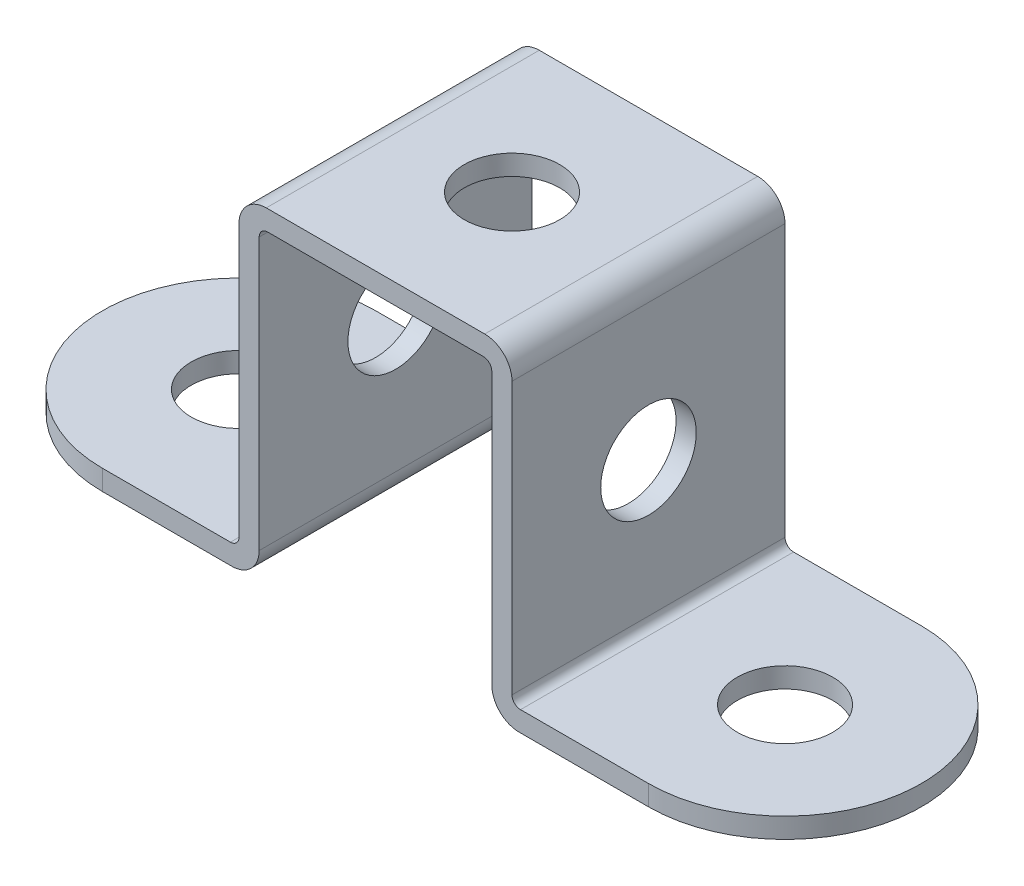
ISO-10303-21;
HEADER;
FILE_DESCRIPTION(('STEP AP214'),'2;1');
FILE_NAME('part.step','',(''),(''),'','','');
FILE_SCHEMA(('AUTOMOTIVE_DESIGN { 1 0 10303 214 1 1 1 1 }'));
ENDSEC;
DATA;
#1=APPLICATION_CONTEXT('core data for automotive mechanical design processes');
#2=APPLICATION_PROTOCOL_DEFINITION('international standard','automotive_design',2000,#1);
#3=PRODUCT_CONTEXT('',#1,'mechanical');
#4=PRODUCT('Part','Part','',(#3));
#5=PRODUCT_RELATED_PRODUCT_CATEGORY('part','',(#4));
#6=PRODUCT_DEFINITION_FORMATION('','',#4);
#7=PRODUCT_DEFINITION_CONTEXT('part definition',#1,'design');
#8=PRODUCT_DEFINITION('design','',#6,#7);
#9=PRODUCT_DEFINITION_SHAPE('','',#8);
#10=(LENGTH_UNIT() NAMED_UNIT(*) SI_UNIT(.MILLI.,.METRE.));
#11=(NAMED_UNIT(*) PLANE_ANGLE_UNIT() SI_UNIT($,.RADIAN.));
#12=(NAMED_UNIT(*) SI_UNIT($,.STERADIAN.) SOLID_ANGLE_UNIT());
#13=UNCERTAINTY_MEASURE_WITH_UNIT(LENGTH_MEASURE(1.E-05),#10,'distance_accuracy_value','');
#14=(GEOMETRIC_REPRESENTATION_CONTEXT(3) GLOBAL_UNCERTAINTY_ASSIGNED_CONTEXT((#13)) GLOBAL_UNIT_ASSIGNED_CONTEXT((#10,
#11,#12)) REPRESENTATION_CONTEXT('',''));
#15=CARTESIAN_POINT('',(0.,0.,0.));
#16=DIRECTION('',(0.,0.,1.));
#17=DIRECTION('',(1.,0.,0.));
#18=AXIS2_PLACEMENT_3D('',#15,#16,#17);
#19=CARTESIAN_POINT('',(25.4,7.62,6.35));
#20=DIRECTION('',(-1.,0.,0.));
#21=DIRECTION('',(0.,0.,1.));
#22=AXIS2_PLACEMENT_3D('',#19,#20,#21);
#23=CYLINDRICAL_SURFACE('',#22,2.2225);
#24=CARTESIAN_POINT('',(13.6398,7.62000000000001,6.35));
#25=DIRECTION('',(-1.,0.,0.));
#26=DIRECTION('',(0.,0.,1.));
#27=AXIS2_PLACEMENT_3D('',#24,#25,#26);
#28=CIRCLE('',#27,2.2225);
#29=CARTESIAN_POINT('',(13.6398,7.62000000000001,8.5725));
#30=VERTEX_POINT('',#29);
#31=EDGE_CURVE('E167',#30,#30,#28,.T.);
#32=ORIENTED_EDGE('',*,*,#31,.F.);
#33=EDGE_LOOP('',(#32));
#34=FACE_BOUND('',#33,.T.);
#35=CARTESIAN_POINT('',(12.7,7.62000000000001,6.35));
#36=DIRECTION('',(1.,0.,0.));
#37=DIRECTION('',(0.,1.,0.));
#38=AXIS2_PLACEMENT_3D('',#35,#36,#37);
#39=CIRCLE('',#38,2.2225);
#40=CARTESIAN_POINT('',(12.7,9.84250000000001,6.35));
#41=VERTEX_POINT('',#40);
#42=EDGE_CURVE('E201',#41,#41,#39,.T.);
#43=ORIENTED_EDGE('',*,*,#42,.F.);
#44=EDGE_LOOP('',(#43));
#45=FACE_BOUND('',#44,.T.);
#46=ADVANCED_FACE('F16',(#34,#45),#23,.F.);
#47=CARTESIAN_POINT('',(25.4,7.62,6.35));
#48=DIRECTION('',(-1.,0.,0.));
#49=DIRECTION('',(0.,0.,1.));
#50=AXIS2_PLACEMENT_3D('',#47,#48,#49);
#51=CYLINDRICAL_SURFACE('',#50,2.2225);
#52=CARTESIAN_POINT('',(24.4602,7.62,6.35));
#53=DIRECTION('',(1.,0.,0.));
#54=DIRECTION('',(0.,1.,0.));
#55=AXIS2_PLACEMENT_3D('',#52,#53,#54);
#56=CIRCLE('',#55,2.2225);
#57=CARTESIAN_POINT('',(24.4602,9.8425,6.35));
#58=VERTEX_POINT('',#57);
#59=EDGE_CURVE('E252',#58,#58,#56,.T.);
#60=ORIENTED_EDGE('',*,*,#59,.F.);
#61=EDGE_LOOP('',(#60));
#62=FACE_BOUND('',#61,.T.);
#63=CARTESIAN_POINT('',(25.4,7.62,6.35));
#64=DIRECTION('',(-1.,0.,0.));
#65=DIRECTION('',(0.,0.,1.));
#66=AXIS2_PLACEMENT_3D('',#63,#64,#65);
#67=CIRCLE('',#66,2.2225);
#68=CARTESIAN_POINT('',(25.4,7.62,8.5725));
#69=VERTEX_POINT('',#68);
#70=EDGE_CURVE('E229',#69,#69,#67,.T.);
#71=ORIENTED_EDGE('',*,*,#70,.F.);
#72=EDGE_LOOP('',(#71));
#73=FACE_BOUND('',#72,.T.);
#74=ADVANCED_FACE('F337',(#62,#73),#51,.F.);
#75=CARTESIAN_POINT('',(6.35,0.,6.35));
#76=DIRECTION('',(0.,1.,0.));
#77=DIRECTION('',(1.,0.,0.));
#78=AXIS2_PLACEMENT_3D('',#75,#76,#77);
#79=CYLINDRICAL_SURFACE('',#78,2.2225);
#80=CARTESIAN_POINT('',(6.35,0.9398,6.35));
#81=DIRECTION('',(0.,-1.,0.));
#82=DIRECTION('',(-1.,0.,0.));
#83=AXIS2_PLACEMENT_3D('',#80,#81,#82);
#84=CIRCLE('',#83,2.2225);
#85=CARTESIAN_POINT('',(4.1275,0.9398,6.35));
#86=VERTEX_POINT('',#85);
#87=EDGE_CURVE('E205',#86,#86,#84,.T.);
#88=ORIENTED_EDGE('',*,*,#87,.F.);
#89=EDGE_LOOP('',(#88));
#90=FACE_BOUND('',#89,.T.);
#91=CARTESIAN_POINT('',(6.35,0.,6.35));
#92=DIRECTION('',(0.,1.,0.));
#93=DIRECTION('',(1.,0.,0.));
#94=AXIS2_PLACEMENT_3D('',#91,#92,#93);
#95=CIRCLE('',#94,2.2225);
#96=CARTESIAN_POINT('',(8.5725,0.,6.35));
#97=VERTEX_POINT('',#96);
#98=EDGE_CURVE('E309',#97,#97,#95,.T.);
#99=ORIENTED_EDGE('',*,*,#98,.F.);
#100=EDGE_LOOP('',(#99));
#101=FACE_BOUND('',#100,.T.);
#102=ADVANCED_FACE('F375',(#90,#101),#79,.F.);
#103=CARTESIAN_POINT('',(6.35,0.,6.35));
#104=DIRECTION('',(0.,1.,0.));
#105=DIRECTION('',(1.,0.,0.));
#106=AXIS2_PLACEMENT_3D('',#103,#104,#105);
#107=CYLINDRICAL_SURFACE('',#106,6.35);
#108=CARTESIAN_POINT('',(6.35,0.9398,6.35));
#109=DIRECTION('',(0.,1.,0.));
#110=DIRECTION('',(1.,0.,0.));
#111=AXIS2_PLACEMENT_3D('',#108,#109,#110);
#112=CIRCLE('',#111,6.35);
#113=CARTESIAN_POINT('',(6.35,0.9398,0.));
#114=VERTEX_POINT('',#113);
#115=CARTESIAN_POINT('',(6.35,0.9398,12.7));
#116=VERTEX_POINT('',#115);
#117=EDGE_CURVE('E34',#114,#116,#112,.T.);
#118=ORIENTED_EDGE('',*,*,#117,.F.);
#119=DIRECTION('',(0.,-1.,0.));
#120=VECTOR('',#119,1.);
#121=CARTESIAN_POINT('',(6.35,0.,0.));
#122=LINE('',#121,#120);
#123=CARTESIAN_POINT('',(6.35,0.,0.));
#124=VERTEX_POINT('',#123);
#125=EDGE_CURVE('E11',#114,#124,#122,.T.);
#126=ORIENTED_EDGE('',*,*,#125,.T.);
#127=CARTESIAN_POINT('',(6.35,0.,6.35));
#128=DIRECTION('',(0.,-1.,0.));
#129=DIRECTION('',(0.,0.,-1.));
#130=AXIS2_PLACEMENT_3D('',#127,#128,#129);
#131=CIRCLE('',#130,6.35);
#132=CARTESIAN_POINT('',(6.35,0.,12.7));
#133=VERTEX_POINT('',#132);
#134=EDGE_CURVE('E182',#133,#124,#131,.T.);
#135=ORIENTED_EDGE('',*,*,#134,.F.);
#136=DIRECTION('',(0.,-1.,0.));
#137=VECTOR('',#136,1.);
#138=CARTESIAN_POINT('',(6.35,0.,12.7));
#139=LINE('',#138,#137);
#140=EDGE_CURVE('E161',#116,#133,#139,.T.);
#141=ORIENTED_EDGE('',*,*,#140,.F.);
#142=EDGE_LOOP('',(#118,#126,#135,#141));
#143=FACE_BOUND('',#142,.T.);
#144=ADVANCED_FACE('F378',(#143),#107,.T.);
#145=CARTESIAN_POINT('',(19.05,0.,6.35));
#146=DIRECTION('',(0.,1.,0.));
#147=DIRECTION('',(1.,0.,0.));
#148=AXIS2_PLACEMENT_3D('',#145,#146,#147);
#149=CYLINDRICAL_SURFACE('',#148,2.2225);
#150=CARTESIAN_POINT('',(19.05,15.24,6.35));
#151=DIRECTION('',(0.,-1.,0.));
#152=DIRECTION('',(0.,0.,-1.));
#153=AXIS2_PLACEMENT_3D('',#150,#151,#152);
#154=CIRCLE('',#153,2.2225);
#155=CARTESIAN_POINT('',(19.05,15.24,4.1275));
#156=VERTEX_POINT('',#155);
#157=EDGE_CURVE('E216',#156,#156,#154,.T.);
#158=ORIENTED_EDGE('',*,*,#157,.F.);
#159=EDGE_LOOP('',(#158));
#160=FACE_BOUND('',#159,.T.);
#161=CARTESIAN_POINT('',(19.05,14.3002,6.35));
#162=DIRECTION('',(0.,1.,0.));
#163=DIRECTION('',(1.,0.,0.));
#164=AXIS2_PLACEMENT_3D('',#161,#162,#163);
#165=CIRCLE('',#164,2.2225);
#166=CARTESIAN_POINT('',(21.2725,14.3002,6.35));
#167=VERTEX_POINT('',#166);
#168=EDGE_CURVE('E267',#167,#167,#165,.T.);
#169=ORIENTED_EDGE('',*,*,#168,.F.);
#170=EDGE_LOOP('',(#169));
#171=FACE_BOUND('',#170,.T.);
#172=ADVANCED_FACE('F429',(#160,#171),#149,.F.);
#173=CARTESIAN_POINT('',(31.75,0.,6.35));
#174=DIRECTION('',(0.,1.,0.));
#175=DIRECTION('',(1.,0.,0.));
#176=AXIS2_PLACEMENT_3D('',#173,#174,#175);
#177=CYLINDRICAL_SURFACE('',#176,6.35);
#178=CARTESIAN_POINT('',(31.75,0.939799999999998,6.35));
#179=DIRECTION('',(0.,1.,0.));
#180=DIRECTION('',(1.,0.,0.));
#181=AXIS2_PLACEMENT_3D('',#178,#179,#180);
#182=CIRCLE('',#181,6.35);
#183=CARTESIAN_POINT('',(31.75,0.939800000000006,12.7));
#184=VERTEX_POINT('',#183);
#185=CARTESIAN_POINT('',(31.75,0.939800000000006,0.));
#186=VERTEX_POINT('',#185);
#187=EDGE_CURVE('E292',#184,#186,#182,.T.);
#188=ORIENTED_EDGE('',*,*,#187,.F.);
#189=DIRECTION('',(0.,-1.,0.));
#190=VECTOR('',#189,1.);
#191=CARTESIAN_POINT('',(31.75,0.,12.7));
#192=LINE('',#191,#190);
#193=CARTESIAN_POINT('',(31.75,0.,12.7));
#194=VERTEX_POINT('',#193);
#195=EDGE_CURVE('E26',#184,#194,#192,.T.);
#196=ORIENTED_EDGE('',*,*,#195,.T.);
#197=CARTESIAN_POINT('',(31.75,0.,6.35));
#198=DIRECTION('',(0.,-1.,0.));
#199=DIRECTION('',(0.,0.,-1.));
#200=AXIS2_PLACEMENT_3D('',#197,#198,#199);
#201=CIRCLE('',#200,6.35);
#202=CARTESIAN_POINT('',(31.75,0.,0.));
#203=VERTEX_POINT('',#202);
#204=EDGE_CURVE('E242',#203,#194,#201,.T.);
#205=ORIENTED_EDGE('',*,*,#204,.F.);
#206=DIRECTION('',(0.,-1.,0.));
#207=VECTOR('',#206,1.);
#208=CARTESIAN_POINT('',(31.75,0.,0.));
#209=LINE('',#208,#207);
#210=EDGE_CURVE('E306',#186,#203,#209,.T.);
#211=ORIENTED_EDGE('',*,*,#210,.F.);
#212=EDGE_LOOP('',(#188,#196,#205,#211));
#213=FACE_BOUND('',#212,.T.);
#214=ADVANCED_FACE('F425',(#213),#177,.T.);
#215=CARTESIAN_POINT('',(31.75,0.,6.35));
#216=DIRECTION('',(0.,1.,0.));
#217=DIRECTION('',(1.,0.,0.));
#218=AXIS2_PLACEMENT_3D('',#215,#216,#217);
#219=CYLINDRICAL_SURFACE('',#218,2.2225);
#220=CARTESIAN_POINT('',(31.75,0.939799999999998,6.35));
#221=DIRECTION('',(0.,-1.,0.));
#222=DIRECTION('',(0.,0.,-1.));
#223=AXIS2_PLACEMENT_3D('',#220,#221,#222);
#224=CIRCLE('',#223,2.2225);
#225=CARTESIAN_POINT('',(31.75,0.939799999999998,4.1275));
#226=VERTEX_POINT('',#225);
#227=EDGE_CURVE('E186',#226,#226,#224,.T.);
#228=ORIENTED_EDGE('',*,*,#227,.F.);
#229=EDGE_LOOP('',(#228));
#230=FACE_BOUND('',#229,.T.);
#231=CARTESIAN_POINT('',(31.75,0.,6.35));
#232=DIRECTION('',(0.,1.,0.));
#233=DIRECTION('',(1.,0.,0.));
#234=AXIS2_PLACEMENT_3D('',#231,#232,#233);
#235=CIRCLE('',#234,2.2225);
#236=CARTESIAN_POINT('',(33.9725,0.,6.35));
#237=VERTEX_POINT('',#236);
#238=EDGE_CURVE('E256',#237,#237,#235,.T.);
#239=ORIENTED_EDGE('',*,*,#238,.F.);
#240=EDGE_LOOP('',(#239));
#241=FACE_BOUND('',#240,.T.);
#242=ADVANCED_FACE('F428',(#230,#241),#219,.F.);
#243=CARTESIAN_POINT('',(19.05,5.94402410050316,0.));
#244=DIRECTION('',(0.,0.,1.));
#245=DIRECTION('',(1.,0.,0.));
#246=AXIS2_PLACEMENT_3D('',#243,#244,#245);
#247=PLANE('',#246);
#248=ORIENTED_EDGE('',*,*,#125,.F.);
#249=DIRECTION('',(-1.,0.,0.));
#250=VECTOR('',#249,1.);
#251=CARTESIAN_POINT('',(12.303125,0.9398,0.));
#252=LINE('',#251,#250);
#253=CARTESIAN_POINT('',(12.303125,0.9398,0.));
#254=VERTEX_POINT('',#253);
#255=EDGE_CURVE('E197',#254,#114,#252,.T.);
#256=ORIENTED_EDGE('',*,*,#255,.F.);
#257=CARTESIAN_POINT('',(12.303125,1.336675,0.));
#258=DIRECTION('',(0.,0.,-1.));
#259=DIRECTION('',(0.,-1.,0.));
#260=AXIS2_PLACEMENT_3D('',#257,#258,#259);
#261=CIRCLE('',#260,0.396875000000004);
#262=CARTESIAN_POINT('',(12.7,1.336675,0.));
#263=VERTEX_POINT('',#262);
#264=EDGE_CURVE('E200',#263,#254,#261,.T.);
#265=ORIENTED_EDGE('',*,*,#264,.F.);
#266=DIRECTION('',(0.,-1.,0.));
#267=VECTOR('',#266,1.);
#268=CARTESIAN_POINT('',(12.7,13.97,0.));
#269=LINE('',#268,#267);
#270=CARTESIAN_POINT('',(12.7,13.97,0.));
#271=VERTEX_POINT('',#270);
#272=EDGE_CURVE('E208',#271,#263,#269,.T.);
#273=ORIENTED_EDGE('',*,*,#272,.F.);
#274=CARTESIAN_POINT('',(13.97,13.97,0.));
#275=DIRECTION('',(0.,0.,1.));
#276=DIRECTION('',(1.,0.,0.));
#277=AXIS2_PLACEMENT_3D('',#274,#275,#276);
#278=CIRCLE('',#277,1.27);
#279=CARTESIAN_POINT('',(13.97,15.24,0.));
#280=VERTEX_POINT('',#279);
#281=EDGE_CURVE('E215',#280,#271,#278,.T.);
#282=ORIENTED_EDGE('',*,*,#281,.F.);
#283=DIRECTION('',(-1.,0.,0.));
#284=VECTOR('',#283,1.);
#285=CARTESIAN_POINT('',(24.13,15.24,0.));
#286=LINE('',#285,#284);
#287=CARTESIAN_POINT('',(24.13,15.24,0.));
#288=VERTEX_POINT('',#287);
#289=EDGE_CURVE('E221',#288,#280,#286,.T.);
#290=ORIENTED_EDGE('',*,*,#289,.F.);
#291=CARTESIAN_POINT('',(24.13,13.97,0.));
#292=DIRECTION('',(0.,0.,1.));
#293=DIRECTION('',(1.,0.,0.));
#294=AXIS2_PLACEMENT_3D('',#291,#292,#293);
#295=CIRCLE('',#294,1.27);
#296=CARTESIAN_POINT('',(25.4,13.97,0.));
#297=VERTEX_POINT('',#296);
#298=EDGE_CURVE('E228',#297,#288,#295,.T.);
#299=ORIENTED_EDGE('',*,*,#298,.F.);
#300=DIRECTION('',(0.,1.,0.));
#301=VECTOR('',#300,1.);
#302=CARTESIAN_POINT('',(25.4,1.336675,0.));
#303=LINE('',#302,#301);
#304=CARTESIAN_POINT('',(25.4,1.336675,0.));
#305=VERTEX_POINT('',#304);
#306=EDGE_CURVE('E234',#305,#297,#303,.T.);
#307=ORIENTED_EDGE('',*,*,#306,.F.);
#308=CARTESIAN_POINT('',(25.796875,1.336675,0.));
#309=DIRECTION('',(0.,0.,-1.));
#310=DIRECTION('',(0.,-1.,0.));
#311=AXIS2_PLACEMENT_3D('',#308,#309,#310);
#312=CIRCLE('',#311,0.396874999999994);
#313=CARTESIAN_POINT('',(25.796875,0.939799999999998,0.));
#314=VERTEX_POINT('',#313);
#315=EDGE_CURVE('E241',#314,#305,#312,.T.);
#316=ORIENTED_EDGE('',*,*,#315,.F.);
#317=DIRECTION('',(-1.,0.,0.));
#318=VECTOR('',#317,1.);
#319=CARTESIAN_POINT('',(38.1,0.939800000000014,0.));
#320=LINE('',#319,#318);
#321=EDGE_CURVE('E190',#186,#314,#320,.T.);
#322=ORIENTED_EDGE('',*,*,#321,.F.);
#323=ORIENTED_EDGE('',*,*,#210,.T.);
#324=DIRECTION('',(1.,0.,0.));
#325=VECTOR('',#324,1.);
#326=CARTESIAN_POINT('',(25.7302,0.,0.));
#327=LINE('',#326,#325);
#328=CARTESIAN_POINT('',(25.7302,0.,0.));
#329=VERTEX_POINT('',#328);
#330=EDGE_CURVE('E248',#329,#203,#327,.T.);
#331=ORIENTED_EDGE('',*,*,#330,.F.);
#332=CARTESIAN_POINT('',(25.7302,1.27,0.));
#333=DIRECTION('',(0.,0.,1.));
#334=DIRECTION('',(1.,0.,0.));
#335=AXIS2_PLACEMENT_3D('',#332,#333,#334);
#336=CIRCLE('',#335,1.27);
#337=CARTESIAN_POINT('',(24.4602,1.27,0.));
#338=VERTEX_POINT('',#337);
#339=EDGE_CURVE('E251',#338,#329,#336,.T.);
#340=ORIENTED_EDGE('',*,*,#339,.F.);
#341=DIRECTION('',(0.,-1.,0.));
#342=VECTOR('',#341,1.);
#343=CARTESIAN_POINT('',(24.4602,13.903325,0.));
#344=LINE('',#343,#342);
#345=CARTESIAN_POINT('',(24.4602,13.903325,0.));
#346=VERTEX_POINT('',#345);
#347=EDGE_CURVE('E259',#346,#338,#344,.T.);
#348=ORIENTED_EDGE('',*,*,#347,.F.);
#349=CARTESIAN_POINT('',(24.063325,13.903325,0.));
#350=DIRECTION('',(0.,0.,-1.));
#351=DIRECTION('',(0.,-1.,0.));
#352=AXIS2_PLACEMENT_3D('',#349,#350,#351);
#353=CIRCLE('',#352,0.396875000000003);
#354=CARTESIAN_POINT('',(24.063325,14.3002,0.));
#355=VERTEX_POINT('',#354);
#356=EDGE_CURVE('E266',#355,#346,#353,.T.);
#357=ORIENTED_EDGE('',*,*,#356,.F.);
#358=DIRECTION('',(1.,0.,0.));
#359=VECTOR('',#358,1.);
#360=CARTESIAN_POINT('',(14.036675,14.3002,0.));
#361=LINE('',#360,#359);
#362=CARTESIAN_POINT('',(14.036675,14.3002,0.));
#363=VERTEX_POINT('',#362);
#364=EDGE_CURVE('E272',#363,#355,#361,.T.);
#365=ORIENTED_EDGE('',*,*,#364,.F.);
#366=CARTESIAN_POINT('',(14.036675,13.903325,0.));
#367=DIRECTION('',(0.,0.,-1.));
#368=DIRECTION('',(0.,-1.,0.));
#369=AXIS2_PLACEMENT_3D('',#366,#367,#368);
#370=CIRCLE('',#369,0.396875000000008);
#371=CARTESIAN_POINT('',(13.6398,13.903325,0.));
#372=VERTEX_POINT('',#371);
#373=EDGE_CURVE('E279',#372,#363,#370,.T.);
#374=ORIENTED_EDGE('',*,*,#373,.F.);
#375=DIRECTION('',(0.,1.,0.));
#376=VECTOR('',#375,1.);
#377=CARTESIAN_POINT('',(13.6398,1.27,0.));
#378=LINE('',#377,#376);
#379=CARTESIAN_POINT('',(13.6398,1.27,0.));
#380=VERTEX_POINT('',#379);
#381=EDGE_CURVE('E168',#380,#372,#378,.T.);
#382=ORIENTED_EDGE('',*,*,#381,.F.);
#383=CARTESIAN_POINT('',(12.3698,1.27,0.));
#384=DIRECTION('',(0.,0.,1.));
#385=DIRECTION('',(1.,0.,0.));
#386=AXIS2_PLACEMENT_3D('',#383,#384,#385);
#387=CIRCLE('',#386,1.27);
#388=CARTESIAN_POINT('',(12.3698,0.,0.));
#389=VERTEX_POINT('',#388);
#390=EDGE_CURVE('E159',#389,#380,#387,.T.);
#391=ORIENTED_EDGE('',*,*,#390,.F.);
#392=DIRECTION('',(1.,0.,0.));
#393=VECTOR('',#392,1.);
#394=CARTESIAN_POINT('',(0.,0.,0.));
#395=LINE('',#394,#393);
#396=EDGE_CURVE('E179',#124,#389,#395,.T.);
#397=ORIENTED_EDGE('',*,*,#396,.F.);
#398=EDGE_LOOP('',(#248,#256,#265,#273,#282,#290,#299,#307,#316,#322,#323,#331,#340,#348,#357,
#365,#374,#382,#391,#397));
#399=FACE_BOUND('',#398,.T.);
#400=ADVANCED_FACE('F361',(#399),#247,.F.);
#401=CARTESIAN_POINT('',(12.3698,0.,0.));
#402=DIRECTION('',(0.,-1.,0.));
#403=DIRECTION('',(0.,0.,-1.));
#404=AXIS2_PLACEMENT_3D('',#401,#402,#403);
#405=PLANE('',#404);
#406=ORIENTED_EDGE('',*,*,#98,.T.);
#407=EDGE_LOOP('',(#406));
#408=FACE_BOUND('',#407,.T.);
#409=ORIENTED_EDGE('',*,*,#134,.T.);
#410=ORIENTED_EDGE('',*,*,#396,.T.);
#411=DIRECTION('',(0.,0.,1.));
#412=VECTOR('',#411,1.);
#413=CARTESIAN_POINT('',(12.3698,0.,0.));
#414=LINE('',#413,#412);
#415=CARTESIAN_POINT('',(12.3698,0.,12.7));
#416=VERTEX_POINT('',#415);
#417=EDGE_CURVE('E183',#389,#416,#414,.T.);
#418=ORIENTED_EDGE('',*,*,#417,.T.);
#419=DIRECTION('',(-1.,0.,0.));
#420=VECTOR('',#419,1.);
#421=CARTESIAN_POINT('',(0.,0.,12.7));
#422=LINE('',#421,#420);
#423=EDGE_CURVE('E172',#416,#133,#422,.T.);
#424=ORIENTED_EDGE('',*,*,#423,.T.);
#425=EDGE_LOOP('',(#409,#410,#418,#424));
#426=FACE_BOUND('',#425,.T.);
#427=ADVANCED_FACE('F382',(#408,#426),#405,.T.);
#428=CARTESIAN_POINT('',(25.796875,0.939799999999998,0.));
#429=DIRECTION('',(0.,1.,0.));
#430=DIRECTION('',(-1.,0.,0.));
#431=AXIS2_PLACEMENT_3D('',#428,#429,#430);
#432=PLANE('',#431);
#433=ORIENTED_EDGE('',*,*,#227,.T.);
#434=EDGE_LOOP('',(#433));
#435=FACE_BOUND('',#434,.T.);
#436=ORIENTED_EDGE('',*,*,#187,.T.);
#437=ORIENTED_EDGE('',*,*,#321,.T.);
#438=DIRECTION('',(0.,0.,1.));
#439=VECTOR('',#438,1.);
#440=CARTESIAN_POINT('',(25.796875,0.939799999999998,0.));
#441=LINE('',#440,#439);
#442=CARTESIAN_POINT('',(25.796875,0.939799999999998,12.7));
#443=VERTEX_POINT('',#442);
#444=EDGE_CURVE('E187',#314,#443,#441,.T.);
#445=ORIENTED_EDGE('',*,*,#444,.T.);
#446=DIRECTION('',(1.,0.,0.));
#447=VECTOR('',#446,1.);
#448=CARTESIAN_POINT('',(38.1,0.939800000000014,12.7));
#449=LINE('',#448,#447);
#450=EDGE_CURVE('E191',#443,#184,#449,.T.);
#451=ORIENTED_EDGE('',*,*,#450,.T.);
#452=EDGE_LOOP('',(#436,#437,#445,#451));
#453=FACE_BOUND('',#452,.T.);
#454=ADVANCED_FACE('F371',(#435,#453),#432,.T.);
#455=CARTESIAN_POINT('',(0.,0.9398,0.));
#456=DIRECTION('',(0.,1.,0.));
#457=DIRECTION('',(-1.,0.,0.));
#458=AXIS2_PLACEMENT_3D('',#455,#456,#457);
#459=PLANE('',#458);
#460=ORIENTED_EDGE('',*,*,#117,.T.);
#461=DIRECTION('',(1.,0.,0.));
#462=VECTOR('',#461,1.);
#463=CARTESIAN_POINT('',(12.303125,0.9398,12.7));
#464=LINE('',#463,#462);
#465=CARTESIAN_POINT('',(12.303125,0.9398,12.7));
#466=VERTEX_POINT('',#465);
#467=EDGE_CURVE('E194',#116,#466,#464,.T.);
#468=ORIENTED_EDGE('',*,*,#467,.T.);
#469=DIRECTION('',(0.,0.,1.));
#470=VECTOR('',#469,1.);
#471=CARTESIAN_POINT('',(12.303125,0.9398,0.));
#472=LINE('',#471,#470);
#473=EDGE_CURVE('E198',#254,#466,#472,.T.);
#474=ORIENTED_EDGE('',*,*,#473,.F.);
#475=ORIENTED_EDGE('',*,*,#255,.T.);
#476=EDGE_LOOP('',(#460,#468,#474,#475));
#477=FACE_BOUND('',#476,.T.);
#478=ORIENTED_EDGE('',*,*,#87,.T.);
#479=EDGE_LOOP('',(#478));
#480=FACE_BOUND('',#479,.T.);
#481=ADVANCED_FACE('F368',(#477,#480),#459,.T.);
#482=CARTESIAN_POINT('',(12.303125,1.336675,0.));
#483=DIRECTION('',(0.,0.,1.));
#484=DIRECTION('',(1.,0.,0.));
#485=AXIS2_PLACEMENT_3D('',#482,#483,#484);
#486=CYLINDRICAL_SURFACE('',#485,0.396875000000004);
#487=CARTESIAN_POINT('',(12.303125,1.336675,12.7));
#488=DIRECTION('',(0.,0.,1.));
#489=DIRECTION('',(1.,0.,0.));
#490=AXIS2_PLACEMENT_3D('',#487,#488,#489);
#491=CIRCLE('',#490,0.396875000000004);
#492=CARTESIAN_POINT('',(12.7,1.336675,12.7));
#493=VERTEX_POINT('',#492);
#494=EDGE_CURVE('E202',#466,#493,#491,.T.);
#495=ORIENTED_EDGE('',*,*,#494,.T.);
#496=DIRECTION('',(0.,0.,1.));
#497=VECTOR('',#496,1.);
#498=CARTESIAN_POINT('',(12.7,1.336675,0.));
#499=LINE('',#498,#497);
#500=EDGE_CURVE('E206',#263,#493,#499,.T.);
#501=ORIENTED_EDGE('',*,*,#500,.F.);
#502=ORIENTED_EDGE('',*,*,#264,.T.);
#503=ORIENTED_EDGE('',*,*,#473,.T.);
#504=EDGE_LOOP('',(#495,#501,#502,#503));
#505=FACE_BOUND('',#504,.T.);
#506=ADVANCED_FACE('F345',(#505),#486,.F.);
#507=CARTESIAN_POINT('',(12.7,1.336675,0.));
#508=DIRECTION('',(-1.,0.,0.));
#509=DIRECTION('',(0.,-1.,0.));
#510=AXIS2_PLACEMENT_3D('',#507,#508,#509);
#511=PLANE('',#510);
#512=ORIENTED_EDGE('',*,*,#42,.T.);
#513=EDGE_LOOP('',(#512));
#514=FACE_BOUND('',#513,.T.);
#515=DIRECTION('',(0.,1.,0.));
#516=VECTOR('',#515,1.);
#517=CARTESIAN_POINT('',(12.7,13.97,12.7));
#518=LINE('',#517,#516);
#519=CARTESIAN_POINT('',(12.7,13.97,12.7));
#520=VERTEX_POINT('',#519);
#521=EDGE_CURVE('E210',#493,#520,#518,.T.);
#522=ORIENTED_EDGE('',*,*,#521,.T.);
#523=DIRECTION('',(0.,0.,1.));
#524=VECTOR('',#523,1.);
#525=CARTESIAN_POINT('',(12.7,13.97,0.));
#526=LINE('',#525,#524);
#527=EDGE_CURVE('E213',#271,#520,#526,.T.);
#528=ORIENTED_EDGE('',*,*,#527,.F.);
#529=ORIENTED_EDGE('',*,*,#272,.T.);
#530=ORIENTED_EDGE('',*,*,#500,.T.);
#531=EDGE_LOOP('',(#522,#528,#529,#530));
#532=FACE_BOUND('',#531,.T.);
#533=ADVANCED_FACE('F341',(#514,#532),#511,.T.);
#534=CARTESIAN_POINT('',(13.97,13.97,0.));
#535=DIRECTION('',(0.,0.,1.));
#536=DIRECTION('',(1.,0.,0.));
#537=AXIS2_PLACEMENT_3D('',#534,#535,#536);
#538=CYLINDRICAL_SURFACE('',#537,1.27);
#539=CARTESIAN_POINT('',(13.97,13.97,12.7));
#540=DIRECTION('',(0.,0.,-1.));
#541=DIRECTION('',(0.,-1.,0.));
#542=AXIS2_PLACEMENT_3D('',#539,#540,#541);
#543=CIRCLE('',#542,1.27);
#544=CARTESIAN_POINT('',(13.97,15.24,12.7));
#545=VERTEX_POINT('',#544);
#546=EDGE_CURVE('E209',#520,#545,#543,.T.);
#547=ORIENTED_EDGE('',*,*,#546,.T.);
#548=DIRECTION('',(0.,0.,1.));
#549=VECTOR('',#548,1.);
#550=CARTESIAN_POINT('',(13.97,15.24,0.));
#551=LINE('',#550,#549);
#552=EDGE_CURVE('E219',#280,#545,#551,.T.);
#553=ORIENTED_EDGE('',*,*,#552,.F.);
#554=ORIENTED_EDGE('',*,*,#281,.T.);
#555=ORIENTED_EDGE('',*,*,#527,.T.);
#556=EDGE_LOOP('',(#547,#553,#554,#555));
#557=FACE_BOUND('',#556,.T.);
#558=ADVANCED_FACE('F344',(#557),#538,.T.);
#559=CARTESIAN_POINT('',(13.97,15.24,0.));
#560=DIRECTION('',(0.,1.,0.));
#561=DIRECTION('',(-1.,0.,0.));
#562=AXIS2_PLACEMENT_3D('',#559,#560,#561);
#563=PLANE('',#562);
#564=ORIENTED_EDGE('',*,*,#157,.T.);
#565=EDGE_LOOP('',(#564));
#566=FACE_BOUND('',#565,.T.);
#567=DIRECTION('',(1.,0.,0.));
#568=VECTOR('',#567,1.);
#569=CARTESIAN_POINT('',(24.13,15.24,12.7));
#570=LINE('',#569,#568);
#571=CARTESIAN_POINT('',(24.13,15.24,12.7));
#572=VERTEX_POINT('',#571);
#573=EDGE_CURVE('E223',#545,#572,#570,.T.);
#574=ORIENTED_EDGE('',*,*,#573,.T.);
#575=DIRECTION('',(0.,0.,1.));
#576=VECTOR('',#575,1.);
#577=CARTESIAN_POINT('',(24.13,15.24,0.));
#578=LINE('',#577,#576);
#579=EDGE_CURVE('E226',#288,#572,#578,.T.);
#580=ORIENTED_EDGE('',*,*,#579,.F.);
#581=ORIENTED_EDGE('',*,*,#289,.T.);
#582=ORIENTED_EDGE('',*,*,#552,.T.);
#583=EDGE_LOOP('',(#574,#580,#581,#582));
#584=FACE_BOUND('',#583,.T.);
#585=ADVANCED_FACE('F415',(#566,#584),#563,.T.);
#586=CARTESIAN_POINT('',(24.13,13.97,0.));
#587=DIRECTION('',(0.,0.,1.));
#588=DIRECTION('',(1.,0.,0.));
#589=AXIS2_PLACEMENT_3D('',#586,#587,#588);
#590=CYLINDRICAL_SURFACE('',#589,1.27);
#591=CARTESIAN_POINT('',(24.13,13.97,12.7));
#592=DIRECTION('',(0.,0.,-1.));
#593=DIRECTION('',(0.,-1.,0.));
#594=AXIS2_PLACEMENT_3D('',#591,#592,#593);
#595=CIRCLE('',#594,1.27);
#596=CARTESIAN_POINT('',(25.4,13.97,12.7));
#597=VERTEX_POINT('',#596);
#598=EDGE_CURVE('E222',#572,#597,#595,.T.);
#599=ORIENTED_EDGE('',*,*,#598,.T.);
#600=DIRECTION('',(0.,0.,1.));
#601=VECTOR('',#600,1.);
#602=CARTESIAN_POINT('',(25.4,13.97,0.));
#603=LINE('',#602,#601);
#604=EDGE_CURVE('E232',#297,#597,#603,.T.);
#605=ORIENTED_EDGE('',*,*,#604,.F.);
#606=ORIENTED_EDGE('',*,*,#298,.T.);
#607=ORIENTED_EDGE('',*,*,#579,.T.);
#608=EDGE_LOOP('',(#599,#605,#606,#607));
#609=FACE_BOUND('',#608,.T.);
#610=ADVANCED_FACE('F411',(#609),#590,.T.);
#611=CARTESIAN_POINT('',(25.4,13.97,0.));
#612=DIRECTION('',(1.,0.,0.));
#613=DIRECTION('',(0.,1.,0.));
#614=AXIS2_PLACEMENT_3D('',#611,#612,#613);
#615=PLANE('',#614);
#616=ORIENTED_EDGE('',*,*,#70,.T.);
#617=EDGE_LOOP('',(#616));
#618=FACE_BOUND('',#617,.T.);
#619=DIRECTION('',(0.,-1.,0.));
#620=VECTOR('',#619,1.);
#621=CARTESIAN_POINT('',(25.4,1.336675,12.7));
#622=LINE('',#621,#620);
#623=CARTESIAN_POINT('',(25.4,1.336675,12.7));
#624=VERTEX_POINT('',#623);
#625=EDGE_CURVE('E236',#597,#624,#622,.T.);
#626=ORIENTED_EDGE('',*,*,#625,.T.);
#627=DIRECTION('',(0.,0.,1.));
#628=VECTOR('',#627,1.);
#629=CARTESIAN_POINT('',(25.4,1.336675,0.));
#630=LINE('',#629,#628);
#631=EDGE_CURVE('E239',#305,#624,#630,.T.);
#632=ORIENTED_EDGE('',*,*,#631,.F.);
#633=ORIENTED_EDGE('',*,*,#306,.T.);
#634=ORIENTED_EDGE('',*,*,#604,.T.);
#635=EDGE_LOOP('',(#626,#632,#633,#634));
#636=FACE_BOUND('',#635,.T.);
#637=ADVANCED_FACE('F414',(#618,#636),#615,.T.);
#638=CARTESIAN_POINT('',(25.796875,1.336675,0.));
#639=DIRECTION('',(0.,0.,1.));
#640=DIRECTION('',(1.,0.,0.));
#641=AXIS2_PLACEMENT_3D('',#638,#639,#640);
#642=CYLINDRICAL_SURFACE('',#641,0.396874999999994);
#643=CARTESIAN_POINT('',(25.796875,1.336675,12.7));
#644=DIRECTION('',(0.,0.,1.));
#645=DIRECTION('',(1.,0.,0.));
#646=AXIS2_PLACEMENT_3D('',#643,#644,#645);
#647=CIRCLE('',#646,0.396874999999994);
#648=EDGE_CURVE('E235',#624,#443,#647,.T.);
#649=ORIENTED_EDGE('',*,*,#648,.T.);
#650=ORIENTED_EDGE('',*,*,#444,.F.);
#651=ORIENTED_EDGE('',*,*,#315,.T.);
#652=ORIENTED_EDGE('',*,*,#631,.T.);
#653=EDGE_LOOP('',(#649,#650,#651,#652));
#654=FACE_BOUND('',#653,.T.);
#655=ADVANCED_FACE('F417',(#654),#642,.F.);
#656=CARTESIAN_POINT('',(38.1,0.,0.));
#657=DIRECTION('',(0.,-1.,0.));
#658=DIRECTION('',(0.,0.,-1.));
#659=AXIS2_PLACEMENT_3D('',#656,#657,#658);
#660=PLANE('',#659);
#661=ORIENTED_EDGE('',*,*,#204,.T.);
#662=DIRECTION('',(-1.,0.,0.));
#663=VECTOR('',#662,1.);
#664=CARTESIAN_POINT('',(25.7302,0.,12.7));
#665=LINE('',#664,#663);
#666=CARTESIAN_POINT('',(25.7302,0.,12.7));
#667=VERTEX_POINT('',#666);
#668=EDGE_CURVE('E245',#194,#667,#665,.T.);
#669=ORIENTED_EDGE('',*,*,#668,.T.);
#670=DIRECTION('',(0.,0.,1.));
#671=VECTOR('',#670,1.);
#672=CARTESIAN_POINT('',(25.7302,0.,0.));
#673=LINE('',#672,#671);
#674=EDGE_CURVE('E249',#329,#667,#673,.T.);
#675=ORIENTED_EDGE('',*,*,#674,.F.);
#676=ORIENTED_EDGE('',*,*,#330,.T.);
#677=EDGE_LOOP('',(#661,#669,#675,#676));
#678=FACE_BOUND('',#677,.T.);
#679=ORIENTED_EDGE('',*,*,#238,.T.);
#680=EDGE_LOOP('',(#679));
#681=FACE_BOUND('',#680,.T.);
#682=ADVANCED_FACE('F409',(#678,#681),#660,.T.);
#683=CARTESIAN_POINT('',(25.7302,1.27,0.));
#684=DIRECTION('',(0.,0.,1.));
#685=DIRECTION('',(1.,0.,0.));
#686=AXIS2_PLACEMENT_3D('',#683,#684,#685);
#687=CYLINDRICAL_SURFACE('',#686,1.27);
#688=CARTESIAN_POINT('',(25.7302,1.27,12.7));
#689=DIRECTION('',(0.,0.,-1.));
#690=DIRECTION('',(0.,-1.,0.));
#691=AXIS2_PLACEMENT_3D('',#688,#689,#690);
#692=CIRCLE('',#691,1.27);
#693=CARTESIAN_POINT('',(24.4602,1.27,12.7));
#694=VERTEX_POINT('',#693);
#695=EDGE_CURVE('E253',#667,#694,#692,.T.);
#696=ORIENTED_EDGE('',*,*,#695,.T.);
#697=DIRECTION('',(0.,0.,1.));
#698=VECTOR('',#697,1.);
#699=CARTESIAN_POINT('',(24.4602,1.27,0.));
#700=LINE('',#699,#698);
#701=EDGE_CURVE('E257',#338,#694,#700,.T.);
#702=ORIENTED_EDGE('',*,*,#701,.F.);
#703=ORIENTED_EDGE('',*,*,#339,.T.);
#704=ORIENTED_EDGE('',*,*,#674,.T.);
#705=EDGE_LOOP('',(#696,#702,#703,#704));
#706=FACE_BOUND('',#705,.T.);
#707=ADVANCED_FACE('F406',(#706),#687,.T.);
#708=CARTESIAN_POINT('',(24.4602,1.27,0.));
#709=DIRECTION('',(-1.,0.,0.));
#710=DIRECTION('',(0.,-1.,0.));
#711=AXIS2_PLACEMENT_3D('',#708,#709,#710);
#712=PLANE('',#711);
#713=ORIENTED_EDGE('',*,*,#59,.T.);
#714=EDGE_LOOP('',(#713));
#715=FACE_BOUND('',#714,.T.);
#716=DIRECTION('',(0.,1.,0.));
#717=VECTOR('',#716,1.);
#718=CARTESIAN_POINT('',(24.4602,13.903325,12.7));
#719=LINE('',#718,#717);
#720=CARTESIAN_POINT('',(24.4602,13.903325,12.7));
#721=VERTEX_POINT('',#720);
#722=EDGE_CURVE('E261',#694,#721,#719,.T.);
#723=ORIENTED_EDGE('',*,*,#722,.T.);
#724=DIRECTION('',(0.,0.,1.));
#725=VECTOR('',#724,1.);
#726=CARTESIAN_POINT('',(24.4602,13.903325,0.));
#727=LINE('',#726,#725);
#728=EDGE_CURVE('E264',#346,#721,#727,.T.);
#729=ORIENTED_EDGE('',*,*,#728,.F.);
#730=ORIENTED_EDGE('',*,*,#347,.T.);
#731=ORIENTED_EDGE('',*,*,#701,.T.);
#732=EDGE_LOOP('',(#723,#729,#730,#731));
#733=FACE_BOUND('',#732,.T.);
#734=ADVANCED_FACE('F404',(#715,#733),#712,.T.);
#735=CARTESIAN_POINT('',(24.063325,13.903325,0.));
#736=DIRECTION('',(0.,0.,1.));
#737=DIRECTION('',(1.,0.,0.));
#738=AXIS2_PLACEMENT_3D('',#735,#736,#737);
#739=CYLINDRICAL_SURFACE('',#738,0.396875000000003);
#740=CARTESIAN_POINT('',(24.063325,13.903325,12.7));
#741=DIRECTION('',(0.,0.,1.));
#742=DIRECTION('',(1.,0.,0.));
#743=AXIS2_PLACEMENT_3D('',#740,#741,#742);
#744=CIRCLE('',#743,0.396875000000003);
#745=CARTESIAN_POINT('',(24.063325,14.3002,12.7));
#746=VERTEX_POINT('',#745);
#747=EDGE_CURVE('E260',#721,#746,#744,.T.);
#748=ORIENTED_EDGE('',*,*,#747,.T.);
#749=DIRECTION('',(0.,0.,1.));
#750=VECTOR('',#749,1.);
#751=CARTESIAN_POINT('',(24.063325,14.3002,0.));
#752=LINE('',#751,#750);
#753=EDGE_CURVE('E270',#355,#746,#752,.T.);
#754=ORIENTED_EDGE('',*,*,#753,.F.);
#755=ORIENTED_EDGE('',*,*,#356,.T.);
#756=ORIENTED_EDGE('',*,*,#728,.T.);
#757=EDGE_LOOP('',(#748,#754,#755,#756));
#758=FACE_BOUND('',#757,.T.);
#759=ADVANCED_FACE('F398',(#758),#739,.F.);
#760=CARTESIAN_POINT('',(24.063325,14.3002,0.));
#761=DIRECTION('',(0.,-1.,0.));
#762=DIRECTION('',(1.,0.,0.));
#763=AXIS2_PLACEMENT_3D('',#760,#761,#762);
#764=PLANE('',#763);
#765=ORIENTED_EDGE('',*,*,#168,.T.);
#766=EDGE_LOOP('',(#765));
#767=FACE_BOUND('',#766,.T.);
#768=DIRECTION('',(-1.,0.,0.));
#769=VECTOR('',#768,1.);
#770=CARTESIAN_POINT('',(14.036675,14.3002,12.7));
#771=LINE('',#770,#769);
#772=CARTESIAN_POINT('',(14.036675,14.3002,12.7));
#773=VERTEX_POINT('',#772);
#774=EDGE_CURVE('E274',#746,#773,#771,.T.);
#775=ORIENTED_EDGE('',*,*,#774,.T.);
#776=DIRECTION('',(0.,0.,1.));
#777=VECTOR('',#776,1.);
#778=CARTESIAN_POINT('',(14.036675,14.3002,0.));
#779=LINE('',#778,#777);
#780=EDGE_CURVE('E277',#363,#773,#779,.T.);
#781=ORIENTED_EDGE('',*,*,#780,.F.);
#782=ORIENTED_EDGE('',*,*,#364,.T.);
#783=ORIENTED_EDGE('',*,*,#753,.T.);
#784=EDGE_LOOP('',(#775,#781,#782,#783));
#785=FACE_BOUND('',#784,.T.);
#786=ADVANCED_FACE('F391',(#767,#785),#764,.T.);
#787=CARTESIAN_POINT('',(14.036675,13.903325,0.));
#788=DIRECTION('',(0.,0.,1.));
#789=DIRECTION('',(1.,0.,0.));
#790=AXIS2_PLACEMENT_3D('',#787,#788,#789);
#791=CYLINDRICAL_SURFACE('',#790,0.396875000000008);
#792=CARTESIAN_POINT('',(14.036675,13.903325,12.7));
#793=DIRECTION('',(0.,0.,1.));
#794=DIRECTION('',(1.,0.,0.));
#795=AXIS2_PLACEMENT_3D('',#792,#793,#794);
#796=CIRCLE('',#795,0.396875000000008);
#797=CARTESIAN_POINT('',(13.6398,13.903325,12.7));
#798=VERTEX_POINT('',#797);
#799=EDGE_CURVE('E273',#773,#798,#796,.T.);
#800=ORIENTED_EDGE('',*,*,#799,.T.);
#801=DIRECTION('',(0.,0.,1.));
#802=VECTOR('',#801,1.);
#803=CARTESIAN_POINT('',(13.6398,13.903325,0.));
#804=LINE('',#803,#802);
#805=EDGE_CURVE('E150',#372,#798,#804,.T.);
#806=ORIENTED_EDGE('',*,*,#805,.F.);
#807=ORIENTED_EDGE('',*,*,#373,.T.);
#808=ORIENTED_EDGE('',*,*,#780,.T.);
#809=EDGE_LOOP('',(#800,#806,#807,#808));
#810=FACE_BOUND('',#809,.T.);
#811=ADVANCED_FACE('F389',(#810),#791,.F.);
#812=CARTESIAN_POINT('',(13.6398,13.903325,0.));
#813=DIRECTION('',(1.,0.,0.));
#814=DIRECTION('',(0.,0.,-1.));
#815=AXIS2_PLACEMENT_3D('',#812,#813,#814);
#816=PLANE('',#815);
#817=ORIENTED_EDGE('',*,*,#31,.T.);
#818=EDGE_LOOP('',(#817));
#819=FACE_BOUND('',#818,.T.);
#820=DIRECTION('',(0.,-1.,0.));
#821=VECTOR('',#820,1.);
#822=CARTESIAN_POINT('',(13.6398,1.27,12.7));
#823=LINE('',#822,#821);
#824=CARTESIAN_POINT('',(13.6398,1.27,12.7));
#825=VERTEX_POINT('',#824);
#826=EDGE_CURVE('E163',#798,#825,#823,.T.);
#827=ORIENTED_EDGE('',*,*,#826,.T.);
#828=DIRECTION('',(0.,0.,1.));
#829=VECTOR('',#828,1.);
#830=CARTESIAN_POINT('',(13.6398,1.27,0.));
#831=LINE('',#830,#829);
#832=EDGE_CURVE('E156',#380,#825,#831,.T.);
#833=ORIENTED_EDGE('',*,*,#832,.F.);
#834=ORIENTED_EDGE('',*,*,#381,.T.);
#835=ORIENTED_EDGE('',*,*,#805,.T.);
#836=EDGE_LOOP('',(#827,#833,#834,#835));
#837=FACE_BOUND('',#836,.T.);
#838=ADVANCED_FACE('F164',(#819,#837),#816,.T.);
#839=CARTESIAN_POINT('',(12.3698,1.27,0.));
#840=DIRECTION('',(0.,0.,1.));
#841=DIRECTION('',(1.,0.,0.));
#842=AXIS2_PLACEMENT_3D('',#839,#840,#841);
#843=CYLINDRICAL_SURFACE('',#842,1.27);
#844=CARTESIAN_POINT('',(12.3698,1.27,12.7));
#845=DIRECTION('',(0.,0.,-1.));
#846=DIRECTION('',(0.,-1.,0.));
#847=AXIS2_PLACEMENT_3D('',#844,#845,#846);
#848=CIRCLE('',#847,1.27);
#849=EDGE_CURVE('E20',#825,#416,#848,.T.);
#850=ORIENTED_EDGE('',*,*,#849,.T.);
#851=ORIENTED_EDGE('',*,*,#417,.F.);
#852=ORIENTED_EDGE('',*,*,#390,.T.);
#853=ORIENTED_EDGE('',*,*,#832,.T.);
#854=EDGE_LOOP('',(#850,#851,#852,#853));
#855=FACE_BOUND('',#854,.T.);
#856=ADVANCED_FACE('F18',(#855),#843,.T.);
#857=CARTESIAN_POINT('',(19.05,5.94402410050316,12.7));
#858=DIRECTION('',(0.,0.,1.));
#859=DIRECTION('',(1.,0.,0.));
#860=AXIS2_PLACEMENT_3D('',#857,#858,#859);
#861=PLANE('',#860);
#862=ORIENTED_EDGE('',*,*,#140,.T.);
#863=ORIENTED_EDGE('',*,*,#423,.F.);
#864=ORIENTED_EDGE('',*,*,#849,.F.);
#865=ORIENTED_EDGE('',*,*,#826,.F.);
#866=ORIENTED_EDGE('',*,*,#799,.F.);
#867=ORIENTED_EDGE('',*,*,#774,.F.);
#868=ORIENTED_EDGE('',*,*,#747,.F.);
#869=ORIENTED_EDGE('',*,*,#722,.F.);
#870=ORIENTED_EDGE('',*,*,#695,.F.);
#871=ORIENTED_EDGE('',*,*,#668,.F.);
#872=ORIENTED_EDGE('',*,*,#195,.F.);
#873=ORIENTED_EDGE('',*,*,#450,.F.);
#874=ORIENTED_EDGE('',*,*,#648,.F.);
#875=ORIENTED_EDGE('',*,*,#625,.F.);
#876=ORIENTED_EDGE('',*,*,#598,.F.);
#877=ORIENTED_EDGE('',*,*,#573,.F.);
#878=ORIENTED_EDGE('',*,*,#546,.F.);
#879=ORIENTED_EDGE('',*,*,#521,.F.);
#880=ORIENTED_EDGE('',*,*,#494,.F.);
#881=ORIENTED_EDGE('',*,*,#467,.F.);
#882=EDGE_LOOP('',(#862,#863,#864,#865,#866,#867,#868,#869,#870,#871,#872,#873,#874,#875,#876,
#877,#878,#879,#880,#881));
#883=FACE_BOUND('',#882,.T.);
#884=ADVANCED_FACE('F170',(#883),#861,.T.);
#885=CLOSED_SHELL('',(#46,#74,#102,#144,#172,#214,#242,#400,#427,#454,#481,#506,#533,#558,#585,
#610,#637,#655,#682,#707,#734,#759,#786,#811,#838,#856,#884));
#886=MANIFOLD_SOLID_BREP('B1',#885);
#887=ADVANCED_BREP_SHAPE_REPRESENTATION('',(#18,#886),#14);
#888=SHAPE_DEFINITION_REPRESENTATION(#9,#887);
ENDSEC;
END-ISO-10303-21;
